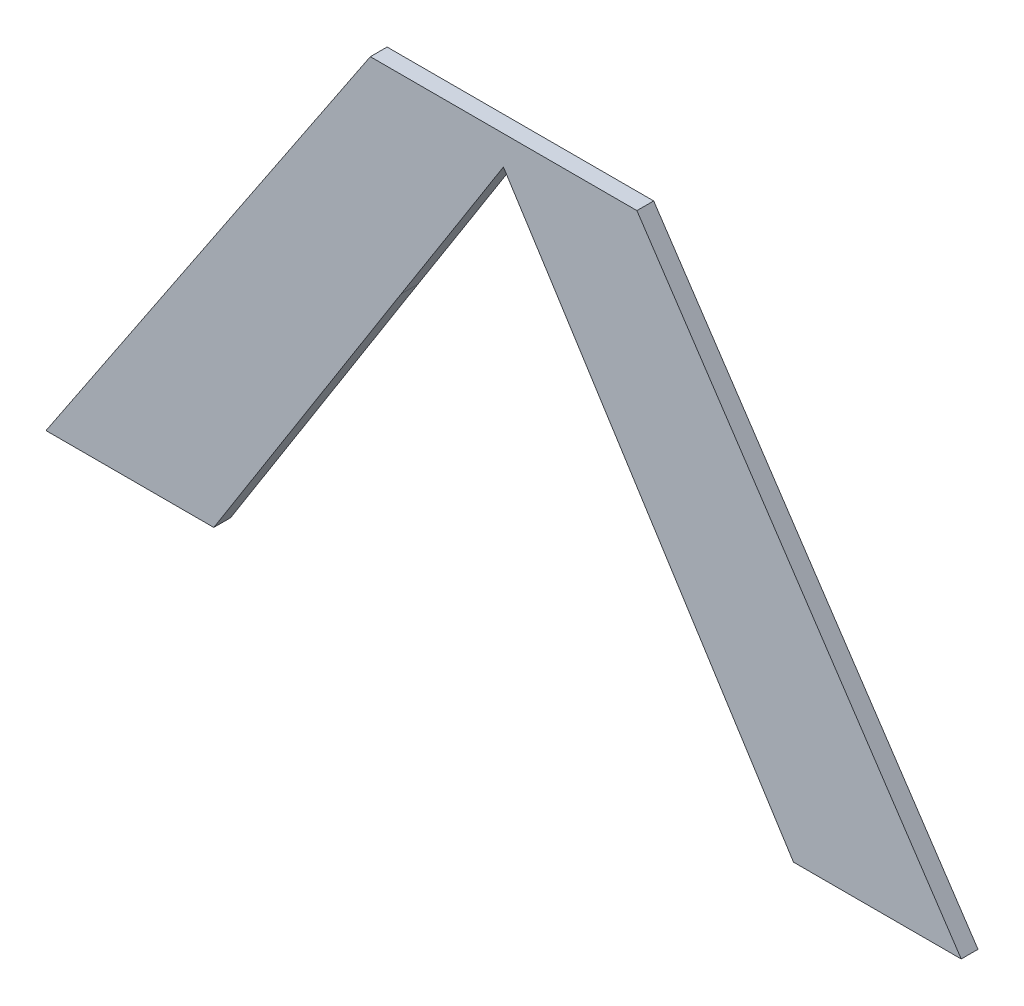
ISO-10303-21;
HEADER;
FILE_DESCRIPTION(('STEP AP214'),'2;1');
FILE_NAME('part.step','',(''),(''),'','','');
FILE_SCHEMA(('AUTOMOTIVE_DESIGN { 1 0 10303 214 1 1 1 1 }'));
ENDSEC;
DATA;
#1=APPLICATION_CONTEXT('core data for automotive mechanical design processes');
#2=APPLICATION_PROTOCOL_DEFINITION('international standard','automotive_design',2000,#1);
#3=PRODUCT_CONTEXT('',#1,'mechanical');
#4=PRODUCT('Part','Part','',(#3));
#5=PRODUCT_RELATED_PRODUCT_CATEGORY('part','',(#4));
#6=PRODUCT_DEFINITION_FORMATION('','',#4);
#7=PRODUCT_DEFINITION_CONTEXT('part definition',#1,'design');
#8=PRODUCT_DEFINITION('design','',#6,#7);
#9=PRODUCT_DEFINITION_SHAPE('','',#8);
#10=(LENGTH_UNIT() NAMED_UNIT(*) SI_UNIT(.MILLI.,.METRE.));
#11=(NAMED_UNIT(*) PLANE_ANGLE_UNIT() SI_UNIT($,.RADIAN.));
#12=(NAMED_UNIT(*) SI_UNIT($,.STERADIAN.) SOLID_ANGLE_UNIT());
#13=UNCERTAINTY_MEASURE_WITH_UNIT(LENGTH_MEASURE(1.E-05),#10,'distance_accuracy_value','');
#14=(GEOMETRIC_REPRESENTATION_CONTEXT(3) GLOBAL_UNCERTAINTY_ASSIGNED_CONTEXT((#13)) GLOBAL_UNIT_ASSIGNED_CONTEXT((#10,
#11,#12)) REPRESENTATION_CONTEXT('',''));
#15=CARTESIAN_POINT('',(0.,0.,0.));
#16=DIRECTION('',(0.,0.,1.));
#17=DIRECTION('',(1.,0.,0.));
#18=AXIS2_PLACEMENT_3D('',#15,#16,#17);
#19=CARTESIAN_POINT('',(-8.68990384615488,-15.,0.5));
#20=DIRECTION('',(0.,1.,0.));
#21=DIRECTION('',(0.,0.,1.));
#22=AXIS2_PLACEMENT_3D('',#19,#20,#21);
#23=PLANE('',#22);
#24=DIRECTION('',(-1.,0.,0.));
#25=VECTOR('',#24,1.);
#26=CARTESIAN_POINT('',(-8.68990384615488,-15.,1.));
#27=LINE('',#26,#25);
#28=CARTESIAN_POINT('',(-8.68990384615488,-15.,1.));
#29=VERTEX_POINT('',#28);
#30=CARTESIAN_POINT('',(-13.6959134615395,-15.,1.));
#31=VERTEX_POINT('',#30);
#32=EDGE_CURVE('E92',#29,#31,#27,.T.);
#33=ORIENTED_EDGE('',*,*,#32,.T.);
#34=DIRECTION('',(0.,0.,1.));
#35=VECTOR('',#34,1.);
#36=CARTESIAN_POINT('',(-13.6959134615395,-15.,0.5));
#37=LINE('',#36,#35);
#38=CARTESIAN_POINT('',(-13.6959134615395,-15.,0.5));
#39=VERTEX_POINT('',#38);
#40=EDGE_CURVE('E147',#39,#31,#37,.T.);
#41=ORIENTED_EDGE('',*,*,#40,.F.);
#42=DIRECTION('',(-1.,0.,0.));
#43=VECTOR('',#42,1.);
#44=CARTESIAN_POINT('',(-8.68990384615488,-15.,0.5));
#45=LINE('',#44,#43);
#46=CARTESIAN_POINT('',(-8.68990384615488,-15.,0.5));
#47=VERTEX_POINT('',#46);
#48=EDGE_CURVE('E61',#47,#39,#45,.T.);
#49=ORIENTED_EDGE('',*,*,#48,.F.);
#50=DIRECTION('',(0.,0.,1.));
#51=VECTOR('',#50,1.);
#52=CARTESIAN_POINT('',(-8.68990384615488,-15.,0.5));
#53=LINE('',#52,#51);
#54=EDGE_CURVE('E132',#47,#29,#53,.T.);
#55=ORIENTED_EDGE('',*,*,#54,.T.);
#56=EDGE_LOOP('',(#33,#41,#49,#55));
#57=FACE_BOUND('',#56,.T.);
#58=ADVANCED_FACE('F39',(#57),#23,.F.);
#59=CARTESIAN_POINT('',(-3.10096153846258,-6.171875,0.5));
#60=DIRECTION('',(-0.844914390503177,0.534901554232781,0.));
#61=DIRECTION('',(-0.534901554232781,-0.844914390503177,0.));
#62=AXIS2_PLACEMENT_3D('',#59,#60,#61);
#63=PLANE('',#62);
#64=DIRECTION('',(-0.534901554232781,-0.844914390503177,0.));
#65=VECTOR('',#64,1.);
#66=CARTESIAN_POINT('',(-3.10096153846258,-6.171875,1.));
#67=LINE('',#66,#65);
#68=CARTESIAN_POINT('',(-3.10096153846258,-6.171875,1.));
#69=VERTEX_POINT('',#68);
#70=EDGE_CURVE('E165',#69,#29,#67,.T.);
#71=ORIENTED_EDGE('',*,*,#70,.T.);
#72=ORIENTED_EDGE('',*,*,#54,.F.);
#73=DIRECTION('',(-0.534901554232781,-0.844914390503177,0.));
#74=VECTOR('',#73,1.);
#75=CARTESIAN_POINT('',(-3.10096153846258,-6.171875,0.5));
#76=LINE('',#75,#74);
#77=CARTESIAN_POINT('',(-3.10096153846258,-6.171875,0.5));
#78=VERTEX_POINT('',#77);
#79=EDGE_CURVE('E120',#78,#47,#76,.T.);
#80=ORIENTED_EDGE('',*,*,#79,.F.);
#81=DIRECTION('',(0.,0.,1.));
#82=VECTOR('',#81,1.);
#83=CARTESIAN_POINT('',(-3.10096153846258,-6.171875,0.5));
#84=LINE('',#83,#82);
#85=EDGE_CURVE('E130',#78,#69,#84,.T.);
#86=ORIENTED_EDGE('',*,*,#85,.T.);
#87=EDGE_LOOP('',(#71,#72,#80,#86));
#88=FACE_BOUND('',#87,.T.);
#89=ADVANCED_FACE('F136',(#88),#63,.F.);
#90=CARTESIAN_POINT('',(-0.0480769230779589,-1.36418269230769,0.5));
#91=CARTESIAN_POINT('',(-0.261127879226488,-1.69626362684779,0.5));
#92=CARTESIAN_POINT('',(-0.715771826660648,-2.40491375297855,0.5));
#93=CARTESIAN_POINT('',(-1.42586902978484,-3.54574334816563,0.5));
#94=CARTESIAN_POINT('',(-2.24275186306295,-4.8084102738214,0.5));
#95=CARTESIAN_POINT('',(-2.80550686217326,-5.70247685540624,0.5));
#96=CARTESIAN_POINT('',(-3.10096153846258,-6.171875,0.5));
#97=B_SPLINE_CURVE_WITH_KNOTS('',3,(#90,#91,#92,#93,#94,#95,#96),.UNSPECIFIED.,.F.,.F.,(4,1,1,1,
4),(0.,0.207833486447409,0.443510033447491,0.707834558225232,1.),.UNSPECIFIED.);
#98=DIRECTION('',(0.,0.,1.));
#99=VECTOR('',#98,1.);
#100=SURFACE_OF_LINEAR_EXTRUSION('',#97,#99);
#101=CARTESIAN_POINT('',(-0.0480769230779589,-1.36418269230769,1.));
#102=CARTESIAN_POINT('',(-0.261127879226488,-1.69626362684779,1.));
#103=CARTESIAN_POINT('',(-0.715771826660648,-2.40491375297855,1.));
#104=CARTESIAN_POINT('',(-1.42586902978484,-3.54574334816563,1.));
#105=CARTESIAN_POINT('',(-2.24275186306295,-4.8084102738214,1.));
#106=CARTESIAN_POINT('',(-2.80550686217326,-5.70247685540624,1.));
#107=CARTESIAN_POINT('',(-3.10096153846258,-6.171875,1.));
#108=B_SPLINE_CURVE_WITH_KNOTS('',3,(#101,#102,#103,#104,#105,#106,#107),.UNSPECIFIED.,.F.,.F.,
(4,1,1,1,4),(0.,0.207833486447409,0.443510033447491,0.707834558225232,1.),.UNSPECIFIED.);
#109=CARTESIAN_POINT('',(-0.0480769230779589,-1.36418269230769,1.));
#110=VERTEX_POINT('',#109);
#111=EDGE_CURVE('E127',#110,#69,#108,.T.);
#112=ORIENTED_EDGE('',*,*,#111,.T.);
#113=ORIENTED_EDGE('',*,*,#85,.F.);
#114=CARTESIAN_POINT('',(-0.0480769230779589,-1.36418269230769,0.5));
#115=VERTEX_POINT('',#114);
#116=EDGE_CURVE('E114',#115,#78,#97,.T.);
#117=ORIENTED_EDGE('',*,*,#116,.F.);
#118=DIRECTION('',(0.,0.,1.));
#119=VECTOR('',#118,1.);
#120=CARTESIAN_POINT('',(-0.0480769230779589,-1.36418269230769,0.5));
#121=LINE('',#120,#119);
#122=EDGE_CURVE('E133',#115,#110,#121,.T.);
#123=ORIENTED_EDGE('',*,*,#122,.T.);
#124=EDGE_LOOP('',(#112,#113,#117,#123));
#125=FACE_BOUND('',#124,.T.);
#126=ADVANCED_FACE('F126',(#125),#100,.F.);
#127=CARTESIAN_POINT('',(2.7884615384605,-5.82932692307692,0.5));
#128=CARTESIAN_POINT('',(2.52713906621149,-5.42124800716116,0.5));
#129=CARTESIAN_POINT('',(2.02064839407174,-4.63031654753804,0.5));
#130=CARTESIAN_POINT('',(1.29915822956654,-3.47104953457032,0.5));
#131=CARTESIAN_POINT('',(0.601160811292834,-2.39953224879346,0.5));
#132=CARTESIAN_POINT('',(0.163329239364389,-1.70131540184616,0.5));
#133=CARTESIAN_POINT('',(-0.0480769230779589,-1.36418269230769,0.5));
#134=B_SPLINE_CURVE_WITH_KNOTS('',3,(#127,#128,#129,#130,#131,#132,#133),.UNSPECIFIED.,.F.,.F.,
(4,1,1,1,4),(0.,0.27480876311885,0.532629566619608,0.774331053092459,1.),.UNSPECIFIED.);
#135=DIRECTION('',(0.,0.,1.));
#136=VECTOR('',#135,1.);
#137=SURFACE_OF_LINEAR_EXTRUSION('',#134,#136);
#138=CARTESIAN_POINT('',(2.7884615384605,-5.82932692307692,1.));
#139=CARTESIAN_POINT('',(2.52713906621149,-5.42124800716116,1.));
#140=CARTESIAN_POINT('',(2.02064839407174,-4.63031654753804,1.));
#141=CARTESIAN_POINT('',(1.29915822956654,-3.47104953457032,1.));
#142=CARTESIAN_POINT('',(0.601160811292834,-2.39953224879346,1.));
#143=CARTESIAN_POINT('',(0.163329239364389,-1.70131540184616,1.));
#144=CARTESIAN_POINT('',(-0.0480769230779589,-1.36418269230769,1.));
#145=B_SPLINE_CURVE_WITH_KNOTS('',3,(#138,#139,#140,#141,#142,#143,#144),.UNSPECIFIED.,.F.,.F.,
(4,1,1,1,4),(0.,0.27480876311885,0.532629566619608,0.774331053092459,1.),.UNSPECIFIED.);
#146=CARTESIAN_POINT('',(2.7884615384605,-5.82932692307692,1.));
#147=VERTEX_POINT('',#146);
#148=EDGE_CURVE('E155',#147,#110,#145,.T.);
#149=ORIENTED_EDGE('',*,*,#148,.T.);
#150=ORIENTED_EDGE('',*,*,#122,.F.);
#151=CARTESIAN_POINT('',(2.7884615384605,-5.82932692307692,0.5));
#152=VERTEX_POINT('',#151);
#153=EDGE_CURVE('E123',#152,#115,#134,.T.);
#154=ORIENTED_EDGE('',*,*,#153,.F.);
#155=DIRECTION('',(0.,0.,1.));
#156=VECTOR('',#155,1.);
#157=CARTESIAN_POINT('',(2.7884615384605,-5.82932692307692,0.5));
#158=LINE('',#157,#156);
#159=EDGE_CURVE('E172',#152,#147,#158,.T.);
#160=ORIENTED_EDGE('',*,*,#159,.T.);
#161=EDGE_LOOP('',(#149,#150,#154,#160));
#162=FACE_BOUND('',#161,.T.);
#163=ADVANCED_FACE('F200',(#162),#137,.F.);
#164=CARTESIAN_POINT('',(8.6057692307682,-15.,0.5));
#165=DIRECTION('',(0.844435320678453,0.535657529761954,0.));
#166=DIRECTION('',(-0.535657529761954,0.844435320678453,0.));
#167=AXIS2_PLACEMENT_3D('',#164,#165,#166);
#168=PLANE('',#167);
#169=DIRECTION('',(-0.535657529761954,0.844435320678453,0.));
#170=VECTOR('',#169,1.);
#171=CARTESIAN_POINT('',(8.6057692307682,-15.,1.));
#172=LINE('',#171,#170);
#173=CARTESIAN_POINT('',(8.6057692307682,-15.,1.));
#174=VERTEX_POINT('',#173);
#175=EDGE_CURVE('E152',#174,#147,#172,.T.);
#176=ORIENTED_EDGE('',*,*,#175,.T.);
#177=ORIENTED_EDGE('',*,*,#159,.F.);
#178=DIRECTION('',(-0.535657529761954,0.844435320678453,0.));
#179=VECTOR('',#178,1.);
#180=CARTESIAN_POINT('',(8.6057692307682,-15.,0.5));
#181=LINE('',#180,#179);
#182=CARTESIAN_POINT('',(8.6057692307682,-15.,0.5));
#183=VERTEX_POINT('',#182);
#184=EDGE_CURVE('E196',#183,#152,#181,.T.);
#185=ORIENTED_EDGE('',*,*,#184,.F.);
#186=DIRECTION('',(0.,0.,1.));
#187=VECTOR('',#186,1.);
#188=CARTESIAN_POINT('',(8.6057692307682,-15.,0.5));
#189=LINE('',#188,#187);
#190=EDGE_CURVE('E180',#183,#174,#189,.T.);
#191=ORIENTED_EDGE('',*,*,#190,.T.);
#192=EDGE_LOOP('',(#176,#177,#185,#191));
#193=FACE_BOUND('',#192,.T.);
#194=ADVANCED_FACE('F197',(#193),#168,.F.);
#195=CARTESIAN_POINT('',(13.6117788461528,-15.,0.5));
#196=DIRECTION('',(0.,1.,0.));
#197=DIRECTION('',(0.,0.,1.));
#198=AXIS2_PLACEMENT_3D('',#195,#196,#197);
#199=PLANE('',#198);
#200=DIRECTION('',(-1.,0.,0.));
#201=VECTOR('',#200,1.);
#202=CARTESIAN_POINT('',(13.6117788461528,-15.,1.));
#203=LINE('',#202,#201);
#204=CARTESIAN_POINT('',(13.6117788461528,-15.,1.));
#205=VERTEX_POINT('',#204);
#206=EDGE_CURVE('E146',#205,#174,#203,.T.);
#207=ORIENTED_EDGE('',*,*,#206,.T.);
#208=ORIENTED_EDGE('',*,*,#190,.F.);
#209=DIRECTION('',(-1.,0.,0.));
#210=VECTOR('',#209,1.);
#211=CARTESIAN_POINT('',(13.6117788461528,-15.,0.5));
#212=LINE('',#211,#210);
#213=CARTESIAN_POINT('',(13.6117788461528,-15.,0.5));
#214=VERTEX_POINT('',#213);
#215=EDGE_CURVE('E187',#214,#183,#212,.T.);
#216=ORIENTED_EDGE('',*,*,#215,.F.);
#217=DIRECTION('',(0.,0.,1.));
#218=VECTOR('',#217,1.);
#219=CARTESIAN_POINT('',(13.6117788461528,-15.,0.5));
#220=LINE('',#219,#218);
#221=EDGE_CURVE('E43',#214,#205,#220,.T.);
#222=ORIENTED_EDGE('',*,*,#221,.T.);
#223=EDGE_LOOP('',(#207,#208,#216,#222));
#224=FACE_BOUND('',#223,.T.);
#225=ADVANCED_FACE('F190',(#224),#199,.F.);
#226=CARTESIAN_POINT('',(1.3726265489838,-3.59519909686312,0.5));
#227=DIRECTION('',(0.,0.,1.));
#228=DIRECTION('',(1.,0.,0.));
#229=AXIS2_PLACEMENT_3D('',#226,#227,#228);
#230=PLANE('',#229);
#231=DIRECTION('',(0.555100444847043,0.831783322825491,0.));
#232=VECTOR('',#231,1.);
#233=CARTESIAN_POINT('',(-13.6959134615395,-15.,0.5));
#234=LINE('',#233,#232);
#235=CARTESIAN_POINT('',(-4.01916685048632,-0.499999999999999,0.5));
#236=VERTEX_POINT('',#235);
#237=EDGE_CURVE('E138',#39,#236,#234,.T.);
#238=ORIENTED_EDGE('',*,*,#237,.T.);
#239=DIRECTION('',(1.,0.,0.));
#240=VECTOR('',#239,1.);
#241=CARTESIAN_POINT('',(1.3726265489838,-0.5,0.5));
#242=LINE('',#241,#240);
#243=CARTESIAN_POINT('',(3.93503223509963,-0.5,0.5));
#244=VERTEX_POINT('',#243);
#245=EDGE_CURVE('E238',#236,#244,#242,.T.);
#246=ORIENTED_EDGE('',*,*,#245,.T.);
#247=DIRECTION('',(0.555100444847043,-0.831783322825491,0.));
#248=VECTOR('',#247,1.);
#249=CARTESIAN_POINT('',(2.07331730769127,2.28966346153846,0.5));
#250=LINE('',#249,#248);
#251=EDGE_CURVE('E102',#244,#214,#250,.T.);
#252=ORIENTED_EDGE('',*,*,#251,.T.);
#253=ORIENTED_EDGE('',*,*,#215,.T.);
#254=ORIENTED_EDGE('',*,*,#184,.T.);
#255=ORIENTED_EDGE('',*,*,#153,.T.);
#256=ORIENTED_EDGE('',*,*,#116,.T.);
#257=ORIENTED_EDGE('',*,*,#79,.T.);
#258=ORIENTED_EDGE('',*,*,#48,.T.);
#259=EDGE_LOOP('',(#238,#246,#252,#253,#254,#255,#256,#257,#258));
#260=FACE_BOUND('',#259,.T.);
#261=ADVANCED_FACE('F117',(#260),#230,.F.);
#262=CARTESIAN_POINT('',(-13.6959134615395,-15.,0.5));
#263=DIRECTION('',(0.831783322825491,-0.555100444847043,0.));
#264=DIRECTION('',(0.555100444847043,0.831783322825491,0.));
#265=AXIS2_PLACEMENT_3D('',#262,#263,#264);
#266=PLANE('',#265);
#267=DIRECTION('',(0.555100444847043,0.831783322825491,0.));
#268=VECTOR('',#267,1.);
#269=CARTESIAN_POINT('',(-13.6959134615395,-15.,1.));
#270=LINE('',#269,#268);
#271=CARTESIAN_POINT('',(-4.01916685048632,-0.5,1.));
#272=VERTEX_POINT('',#271);
#273=EDGE_CURVE('E170',#31,#272,#270,.T.);
#274=ORIENTED_EDGE('',*,*,#273,.T.);
#275=DIRECTION('',(0.,0.,-1.));
#276=VECTOR('',#275,1.);
#277=CARTESIAN_POINT('',(-4.01916685048632,-0.500000000000002,0.5));
#278=LINE('',#277,#276);
#279=EDGE_CURVE('E245',#272,#236,#278,.T.);
#280=ORIENTED_EDGE('',*,*,#279,.T.);
#281=ORIENTED_EDGE('',*,*,#237,.F.);
#282=ORIENTED_EDGE('',*,*,#40,.T.);
#283=EDGE_LOOP('',(#274,#280,#281,#282));
#284=FACE_BOUND('',#283,.T.);
#285=ADVANCED_FACE('F217',(#284),#266,.F.);
#286=CARTESIAN_POINT('',(2.07331730769127,2.28966346153846,0.5));
#287=DIRECTION('',(-0.831783322825491,-0.555100444847043,0.));
#288=DIRECTION('',(0.555100444847043,-0.831783322825491,0.));
#289=AXIS2_PLACEMENT_3D('',#286,#287,#288);
#290=PLANE('',#289);
#291=ORIENTED_EDGE('',*,*,#251,.F.);
#292=DIRECTION('',(0.,0.,1.));
#293=VECTOR('',#292,1.);
#294=CARTESIAN_POINT('',(3.93503223509963,-0.5,0.5));
#295=LINE('',#294,#293);
#296=CARTESIAN_POINT('',(3.93503223509963,-0.5,1.));
#297=VERTEX_POINT('',#296);
#298=EDGE_CURVE('E54',#244,#297,#295,.T.);
#299=ORIENTED_EDGE('',*,*,#298,.T.);
#300=DIRECTION('',(0.555100444847043,-0.831783322825491,0.));
#301=VECTOR('',#300,1.);
#302=CARTESIAN_POINT('',(2.07331730769127,2.28966346153846,1.));
#303=LINE('',#302,#301);
#304=EDGE_CURVE('E150',#297,#205,#303,.T.);
#305=ORIENTED_EDGE('',*,*,#304,.T.);
#306=ORIENTED_EDGE('',*,*,#221,.F.);
#307=EDGE_LOOP('',(#291,#299,#305,#306));
#308=FACE_BOUND('',#307,.T.);
#309=ADVANCED_FACE('F41',(#308),#290,.F.);
#310=CARTESIAN_POINT('',(1.3726265489838,-3.59519909686312,1.));
#311=DIRECTION('',(0.,0.,1.));
#312=DIRECTION('',(1.,0.,0.));
#313=AXIS2_PLACEMENT_3D('',#310,#311,#312);
#314=PLANE('',#313);
#315=ORIENTED_EDGE('',*,*,#304,.F.);
#316=DIRECTION('',(-1.,0.,0.));
#317=VECTOR('',#316,1.);
#318=CARTESIAN_POINT('',(-17.,-0.5,1.));
#319=LINE('',#318,#317);
#320=EDGE_CURVE('E11',#297,#272,#319,.T.);
#321=ORIENTED_EDGE('',*,*,#320,.T.);
#322=ORIENTED_EDGE('',*,*,#273,.F.);
#323=ORIENTED_EDGE('',*,*,#32,.F.);
#324=ORIENTED_EDGE('',*,*,#70,.F.);
#325=ORIENTED_EDGE('',*,*,#111,.F.);
#326=ORIENTED_EDGE('',*,*,#148,.F.);
#327=ORIENTED_EDGE('',*,*,#175,.F.);
#328=ORIENTED_EDGE('',*,*,#206,.F.);
#329=EDGE_LOOP('',(#315,#321,#322,#323,#324,#325,#326,#327,#328));
#330=FACE_BOUND('',#329,.T.);
#331=ADVANCED_FACE('F195',(#330),#314,.T.);
#332=CARTESIAN_POINT('',(-17.,-0.5,1.));
#333=DIRECTION('',(0.,-1.,0.));
#334=DIRECTION('',(0.,0.,-1.));
#335=AXIS2_PLACEMENT_3D('',#332,#333,#334);
#336=PLANE('',#335);
#337=ORIENTED_EDGE('',*,*,#245,.F.);
#338=ORIENTED_EDGE('',*,*,#279,.F.);
#339=ORIENTED_EDGE('',*,*,#320,.F.);
#340=ORIENTED_EDGE('',*,*,#298,.F.);
#341=EDGE_LOOP('',(#337,#338,#339,#340));
#342=FACE_BOUND('',#341,.T.);
#343=ADVANCED_FACE('F232',(#342),#336,.F.);
#344=CLOSED_SHELL('',(#58,#89,#126,#163,#194,#225,#261,#285,#309,#331,#343));
#345=MANIFOLD_SOLID_BREP('B2',#344);
#346=ADVANCED_BREP_SHAPE_REPRESENTATION('',(#18,#345),#14);
#347=SHAPE_DEFINITION_REPRESENTATION(#9,#346);
ENDSEC;
END-ISO-10303-21;
